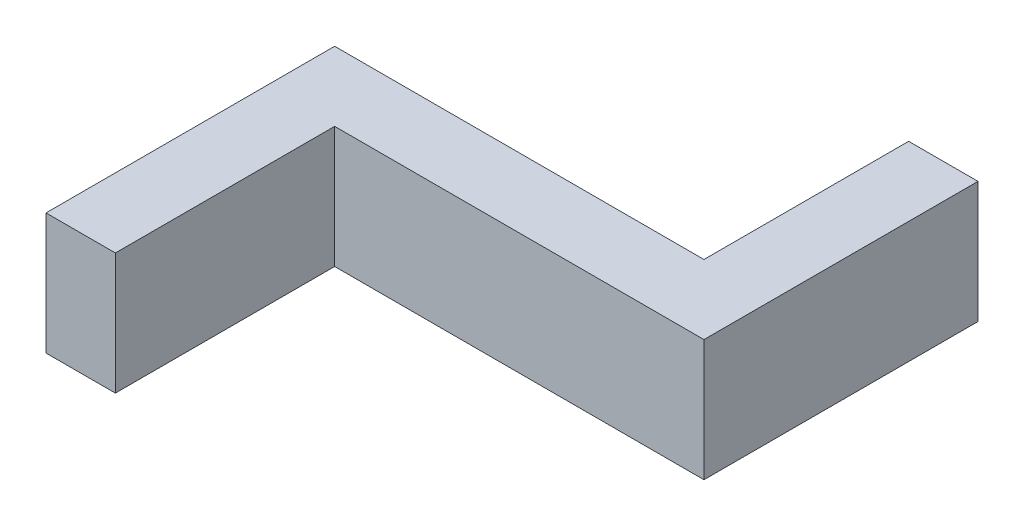
ISO-10303-21;
HEADER;
FILE_DESCRIPTION(('STEP AP214'),'2;1');
FILE_NAME('part.step','',(''),(''),'','','');
FILE_SCHEMA(('AUTOMOTIVE_DESIGN { 1 0 10303 214 1 1 1 1 }'));
ENDSEC;
DATA;
#1=APPLICATION_CONTEXT('core data for automotive mechanical design processes');
#2=APPLICATION_PROTOCOL_DEFINITION('international standard','automotive_design',2000,#1);
#3=PRODUCT_CONTEXT('',#1,'mechanical');
#4=PRODUCT('Part','Part','',(#3));
#5=PRODUCT_RELATED_PRODUCT_CATEGORY('part','',(#4));
#6=PRODUCT_DEFINITION_FORMATION('','',#4);
#7=PRODUCT_DEFINITION_CONTEXT('part definition',#1,'design');
#8=PRODUCT_DEFINITION('design','',#6,#7);
#9=PRODUCT_DEFINITION_SHAPE('','',#8);
#10=(LENGTH_UNIT() NAMED_UNIT(*) SI_UNIT(.MILLI.,.METRE.));
#11=(NAMED_UNIT(*) PLANE_ANGLE_UNIT() SI_UNIT($,.RADIAN.));
#12=(NAMED_UNIT(*) SI_UNIT($,.STERADIAN.) SOLID_ANGLE_UNIT());
#13=UNCERTAINTY_MEASURE_WITH_UNIT(LENGTH_MEASURE(1.E-05),#10,'distance_accuracy_value','');
#14=(GEOMETRIC_REPRESENTATION_CONTEXT(3) GLOBAL_UNCERTAINTY_ASSIGNED_CONTEXT((#13)) GLOBAL_UNIT_ASSIGNED_CONTEXT((#10,
#11,#12)) REPRESENTATION_CONTEXT('',''));
#15=CARTESIAN_POINT('',(0.,0.,0.));
#16=DIRECTION('',(0.,0.,1.));
#17=DIRECTION('',(1.,0.,0.));
#18=AXIS2_PLACEMENT_3D('',#15,#16,#17);
#19=CARTESIAN_POINT('',(0.,8.5,0.));
#20=DIRECTION('',(0.,1.,0.));
#21=DIRECTION('',(0.,0.,1.));
#22=AXIS2_PLACEMENT_3D('',#19,#20,#21);
#23=PLANE('',#22);
#24=DIRECTION('',(-1.,0.,0.));
#25=VECTOR('',#24,1.);
#26=CARTESIAN_POINT('',(72.7421192218373,8.5,-71.));
#27=LINE('',#26,#25);
#28=CARTESIAN_POINT('',(72.7421192218373,8.5,-71.));
#29=VERTEX_POINT('',#28);
#30=CARTESIAN_POINT('',(68.7421192218372,8.5,-71.0000000000003));
#31=VERTEX_POINT('',#30);
#32=EDGE_CURVE('E48',#29,#31,#27,.T.);
#33=ORIENTED_EDGE('',*,*,#32,.T.);
#34=DIRECTION('',(0.,0.,1.));
#35=VECTOR('',#34,1.);
#36=CARTESIAN_POINT('',(68.7421192218372,8.5,-71.0000000000003));
#37=LINE('',#36,#35);
#38=CARTESIAN_POINT('',(68.7421192218372,8.5,-59.1986016699618));
#39=VERTEX_POINT('',#38);
#40=EDGE_CURVE('E90',#31,#39,#37,.T.);
#41=ORIENTED_EDGE('',*,*,#40,.T.);
#42=DIRECTION('',(-1.,0.,0.));
#43=VECTOR('',#42,1.);
#44=CARTESIAN_POINT('',(68.7421192218372,8.5,-59.1986016699618));
#45=LINE('',#44,#43);
#46=CARTESIAN_POINT('',(47.4470564985337,8.5,-59.1986016699618));
#47=VERTEX_POINT('',#46);
#48=EDGE_CURVE('E93',#39,#47,#45,.T.);
#49=ORIENTED_EDGE('',*,*,#48,.T.);
#50=DIRECTION('',(0.,0.,1.));
#51=VECTOR('',#50,1.);
#52=CARTESIAN_POINT('',(47.4470564985337,8.5,-59.1986016699618));
#53=LINE('',#52,#51);
#54=CARTESIAN_POINT('',(47.4470564985337,8.5,-42.5546581780002));
#55=VERTEX_POINT('',#54);
#56=EDGE_CURVE('E109',#47,#55,#53,.T.);
#57=ORIENTED_EDGE('',*,*,#56,.T.);
#58=DIRECTION('',(1.,0.,0.));
#59=VECTOR('',#58,1.);
#60=CARTESIAN_POINT('',(47.4470564985337,8.5,-42.5546581780002));
#61=LINE('',#60,#59);
#62=CARTESIAN_POINT('',(51.4470564985337,8.5,-42.5546581780002));
#63=VERTEX_POINT('',#62);
#64=EDGE_CURVE('E111',#55,#63,#61,.T.);
#65=ORIENTED_EDGE('',*,*,#64,.T.);
#66=DIRECTION('',(0.,0.,-1.));
#67=VECTOR('',#66,1.);
#68=CARTESIAN_POINT('',(51.4470564985337,8.5,-42.5546581780002));
#69=LINE('',#68,#67);
#70=CARTESIAN_POINT('',(51.4470564985337,8.5,-55.1986016699618));
#71=VERTEX_POINT('',#70);
#72=EDGE_CURVE('E115',#63,#71,#69,.T.);
#73=ORIENTED_EDGE('',*,*,#72,.T.);
#74=DIRECTION('',(1.,0.,0.));
#75=VECTOR('',#74,1.);
#76=CARTESIAN_POINT('',(51.4470564985337,8.5,-55.1986016699618));
#77=LINE('',#76,#75);
#78=CARTESIAN_POINT('',(72.7421192218373,8.5,-55.1986016699618));
#79=VERTEX_POINT('',#78);
#80=EDGE_CURVE('E117',#71,#79,#77,.T.);
#81=ORIENTED_EDGE('',*,*,#80,.T.);
#82=DIRECTION('',(0.,0.,-1.));
#83=VECTOR('',#82,1.);
#84=CARTESIAN_POINT('',(72.7421192218373,8.5,-55.1986016699618));
#85=LINE('',#84,#83);
#86=EDGE_CURVE('E119',#79,#29,#85,.T.);
#87=ORIENTED_EDGE('',*,*,#86,.T.);
#88=EDGE_LOOP('',(#33,#41,#49,#57,#65,#73,#81,#87));
#89=FACE_BOUND('',#88,.T.);
#90=ADVANCED_FACE('F45',(#89),#23,.T.);
#91=CARTESIAN_POINT('',(68.7421192218372,8.5,-59.1986016699618));
#92=DIRECTION('',(0.,0.,1.));
#93=DIRECTION('',(1.,0.,0.));
#94=AXIS2_PLACEMENT_3D('',#91,#92,#93);
#95=PLANE('',#94);
#96=DIRECTION('',(-1.,0.,0.));
#97=VECTOR('',#96,1.);
#98=CARTESIAN_POINT('',(68.7421192218372,1.5,-59.1986016699618));
#99=LINE('',#98,#97);
#100=CARTESIAN_POINT('',(68.7421192218372,1.5,-59.1986016699618));
#101=VERTEX_POINT('',#100);
#102=CARTESIAN_POINT('',(47.4470564985337,1.5,-59.1986016699618));
#103=VERTEX_POINT('',#102);
#104=EDGE_CURVE('E62',#101,#103,#99,.T.);
#105=ORIENTED_EDGE('',*,*,#104,.T.);
#106=DIRECTION('',(0.,-1.,0.));
#107=VECTOR('',#106,1.);
#108=CARTESIAN_POINT('',(47.4470564985337,8.5,-59.1986016699618));
#109=LINE('',#108,#107);
#110=EDGE_CURVE('E103',#47,#103,#109,.T.);
#111=ORIENTED_EDGE('',*,*,#110,.F.);
#112=ORIENTED_EDGE('',*,*,#48,.F.);
#113=DIRECTION('',(0.,-1.,0.));
#114=VECTOR('',#113,1.);
#115=CARTESIAN_POINT('',(68.7421192218372,8.5,-59.1986016699618));
#116=LINE('',#115,#114);
#117=EDGE_CURVE('E100',#39,#101,#116,.T.);
#118=ORIENTED_EDGE('',*,*,#117,.T.);
#119=EDGE_LOOP('',(#105,#111,#112,#118));
#120=FACE_BOUND('',#119,.T.);
#121=ADVANCED_FACE('F106',(#120),#95,.F.);
#122=CARTESIAN_POINT('',(47.4470564985337,8.5,-59.1986016699618));
#123=DIRECTION('',(1.,0.,0.));
#124=DIRECTION('',(0.,0.,-1.));
#125=AXIS2_PLACEMENT_3D('',#122,#123,#124);
#126=PLANE('',#125);
#127=DIRECTION('',(0.,0.,1.));
#128=VECTOR('',#127,1.);
#129=CARTESIAN_POINT('',(47.4470564985337,1.5,-59.1986016699618));
#130=LINE('',#129,#128);
#131=CARTESIAN_POINT('',(47.4470564985337,1.5,-42.5546581780002));
#132=VERTEX_POINT('',#131);
#133=EDGE_CURVE('E124',#103,#132,#130,.T.);
#134=ORIENTED_EDGE('',*,*,#133,.T.);
#135=DIRECTION('',(0.,-1.,0.));
#136=VECTOR('',#135,1.);
#137=CARTESIAN_POINT('',(47.4470564985337,8.5,-42.5546581780002));
#138=LINE('',#137,#136);
#139=EDGE_CURVE('E150',#55,#132,#138,.T.);
#140=ORIENTED_EDGE('',*,*,#139,.F.);
#141=ORIENTED_EDGE('',*,*,#56,.F.);
#142=ORIENTED_EDGE('',*,*,#110,.T.);
#143=EDGE_LOOP('',(#134,#140,#141,#142));
#144=FACE_BOUND('',#143,.T.);
#145=ADVANCED_FACE('F191',(#144),#126,.F.);
#146=CARTESIAN_POINT('',(47.4470564985337,8.5,-42.5546581780002));
#147=DIRECTION('',(0.,0.,-1.));
#148=DIRECTION('',(-1.,0.,0.));
#149=AXIS2_PLACEMENT_3D('',#146,#147,#148);
#150=PLANE('',#149);
#151=DIRECTION('',(1.,0.,0.));
#152=VECTOR('',#151,1.);
#153=CARTESIAN_POINT('',(47.4470564985337,1.5,-42.5546581780002));
#154=LINE('',#153,#152);
#155=CARTESIAN_POINT('',(51.4470564985337,1.5,-42.5546581780002));
#156=VERTEX_POINT('',#155);
#157=EDGE_CURVE('E127',#132,#156,#154,.T.);
#158=ORIENTED_EDGE('',*,*,#157,.T.);
#159=DIRECTION('',(0.,-1.,0.));
#160=VECTOR('',#159,1.);
#161=CARTESIAN_POINT('',(51.4470564985337,8.5,-42.5546581780002));
#162=LINE('',#161,#160);
#163=EDGE_CURVE('E147',#63,#156,#162,.T.);
#164=ORIENTED_EDGE('',*,*,#163,.F.);
#165=ORIENTED_EDGE('',*,*,#64,.F.);
#166=ORIENTED_EDGE('',*,*,#139,.T.);
#167=EDGE_LOOP('',(#158,#164,#165,#166));
#168=FACE_BOUND('',#167,.T.);
#169=ADVANCED_FACE('F188',(#168),#150,.F.);
#170=CARTESIAN_POINT('',(51.4470564985337,8.5,-42.5546581780002));
#171=DIRECTION('',(-1.,0.,0.));
#172=DIRECTION('',(0.,0.,1.));
#173=AXIS2_PLACEMENT_3D('',#170,#171,#172);
#174=PLANE('',#173);
#175=DIRECTION('',(0.,0.,-1.));
#176=VECTOR('',#175,1.);
#177=CARTESIAN_POINT('',(51.4470564985337,1.5,-42.5546581780002));
#178=LINE('',#177,#176);
#179=CARTESIAN_POINT('',(51.4470564985337,1.5,-55.1986016699618));
#180=VERTEX_POINT('',#179);
#181=EDGE_CURVE('E130',#156,#180,#178,.T.);
#182=ORIENTED_EDGE('',*,*,#181,.T.);
#183=DIRECTION('',(0.,-1.,0.));
#184=VECTOR('',#183,1.);
#185=CARTESIAN_POINT('',(51.4470564985337,8.5,-55.1986016699618));
#186=LINE('',#185,#184);
#187=EDGE_CURVE('E144',#71,#180,#186,.T.);
#188=ORIENTED_EDGE('',*,*,#187,.F.);
#189=ORIENTED_EDGE('',*,*,#72,.F.);
#190=ORIENTED_EDGE('',*,*,#163,.T.);
#191=EDGE_LOOP('',(#182,#188,#189,#190));
#192=FACE_BOUND('',#191,.T.);
#193=ADVANCED_FACE('F181',(#192),#174,.F.);
#194=CARTESIAN_POINT('',(51.4470564985337,8.5,-55.1986016699618));
#195=DIRECTION('',(0.,0.,-1.));
#196=DIRECTION('',(-1.,0.,0.));
#197=AXIS2_PLACEMENT_3D('',#194,#195,#196);
#198=PLANE('',#197);
#199=DIRECTION('',(1.,0.,0.));
#200=VECTOR('',#199,1.);
#201=CARTESIAN_POINT('',(51.4470564985337,1.5,-55.1986016699618));
#202=LINE('',#201,#200);
#203=CARTESIAN_POINT('',(72.7421192218373,1.5,-55.1986016699618));
#204=VERTEX_POINT('',#203);
#205=EDGE_CURVE('E133',#180,#204,#202,.T.);
#206=ORIENTED_EDGE('',*,*,#205,.T.);
#207=DIRECTION('',(0.,-1.,0.));
#208=VECTOR('',#207,1.);
#209=CARTESIAN_POINT('',(72.7421192218373,8.5,-55.1986016699618));
#210=LINE('',#209,#208);
#211=EDGE_CURVE('E141',#79,#204,#210,.T.);
#212=ORIENTED_EDGE('',*,*,#211,.F.);
#213=ORIENTED_EDGE('',*,*,#80,.F.);
#214=ORIENTED_EDGE('',*,*,#187,.T.);
#215=EDGE_LOOP('',(#206,#212,#213,#214));
#216=FACE_BOUND('',#215,.T.);
#217=ADVANCED_FACE('F174',(#216),#198,.F.);
#218=CARTESIAN_POINT('',(72.7421192218373,8.5,-55.1986016699618));
#219=DIRECTION('',(-1.,0.,0.));
#220=DIRECTION('',(0.,0.,1.));
#221=AXIS2_PLACEMENT_3D('',#218,#219,#220);
#222=PLANE('',#221);
#223=DIRECTION('',(0.,0.,-1.));
#224=VECTOR('',#223,1.);
#225=CARTESIAN_POINT('',(72.7421192218373,1.5,-55.1986016699618));
#226=LINE('',#225,#224);
#227=CARTESIAN_POINT('',(72.7421192218373,1.5,-71.));
#228=VERTEX_POINT('',#227);
#229=EDGE_CURVE('E136',#204,#228,#226,.T.);
#230=ORIENTED_EDGE('',*,*,#229,.T.);
#231=DIRECTION('',(0.,-1.,0.));
#232=VECTOR('',#231,1.);
#233=CARTESIAN_POINT('',(72.7421192218373,8.5,-71.));
#234=LINE('',#233,#232);
#235=EDGE_CURVE('E120',#29,#228,#234,.T.);
#236=ORIENTED_EDGE('',*,*,#235,.F.);
#237=ORIENTED_EDGE('',*,*,#86,.F.);
#238=ORIENTED_EDGE('',*,*,#211,.T.);
#239=EDGE_LOOP('',(#230,#236,#237,#238));
#240=FACE_BOUND('',#239,.T.);
#241=ADVANCED_FACE('F167',(#240),#222,.F.);
#242=CARTESIAN_POINT('',(72.7421192218373,8.5,-71.));
#243=DIRECTION('',(0.,0.,1.));
#244=DIRECTION('',(1.,0.,0.));
#245=AXIS2_PLACEMENT_3D('',#242,#243,#244);
#246=PLANE('',#245);
#247=DIRECTION('',(-1.,0.,0.));
#248=VECTOR('',#247,1.);
#249=CARTESIAN_POINT('',(72.7421192218373,1.5,-71.));
#250=LINE('',#249,#248);
#251=CARTESIAN_POINT('',(68.7421192218372,1.5,-71.0000000000003));
#252=VERTEX_POINT('',#251);
#253=EDGE_CURVE('E11',#228,#252,#250,.T.);
#254=ORIENTED_EDGE('',*,*,#253,.T.);
#255=DIRECTION('',(0.,-1.,0.));
#256=VECTOR('',#255,1.);
#257=CARTESIAN_POINT('',(68.7421192218372,8.5,-71.0000000000003));
#258=LINE('',#257,#256);
#259=EDGE_CURVE('E104',#31,#252,#258,.T.);
#260=ORIENTED_EDGE('',*,*,#259,.F.);
#261=ORIENTED_EDGE('',*,*,#32,.F.);
#262=ORIENTED_EDGE('',*,*,#235,.T.);
#263=EDGE_LOOP('',(#254,#260,#261,#262));
#264=FACE_BOUND('',#263,.T.);
#265=ADVANCED_FACE('F159',(#264),#246,.F.);
#266=CARTESIAN_POINT('',(68.7421192218372,8.5,-71.0000000000003));
#267=DIRECTION('',(1.,0.,0.));
#268=DIRECTION('',(0.,0.,-1.));
#269=AXIS2_PLACEMENT_3D('',#266,#267,#268);
#270=PLANE('',#269);
#271=DIRECTION('',(0.,0.,1.));
#272=VECTOR('',#271,1.);
#273=CARTESIAN_POINT('',(68.7421192218372,1.5,-71.0000000000003));
#274=LINE('',#273,#272);
#275=EDGE_CURVE('E54',#252,#101,#274,.T.);
#276=ORIENTED_EDGE('',*,*,#275,.T.);
#277=ORIENTED_EDGE('',*,*,#117,.F.);
#278=ORIENTED_EDGE('',*,*,#40,.F.);
#279=ORIENTED_EDGE('',*,*,#259,.T.);
#280=EDGE_LOOP('',(#276,#277,#278,#279));
#281=FACE_BOUND('',#280,.T.);
#282=ADVANCED_FACE('F101',(#281),#270,.F.);
#283=CARTESIAN_POINT('',(73.3743669279539,1.5,-99.6600063705348));
#284=DIRECTION('',(0.,1.,0.));
#285=DIRECTION('',(0.,0.,1.));
#286=AXIS2_PLACEMENT_3D('',#283,#284,#285);
#287=PLANE('',#286);
#288=ORIENTED_EDGE('',*,*,#275,.F.);
#289=ORIENTED_EDGE('',*,*,#253,.F.);
#290=ORIENTED_EDGE('',*,*,#229,.F.);
#291=ORIENTED_EDGE('',*,*,#205,.F.);
#292=ORIENTED_EDGE('',*,*,#181,.F.);
#293=ORIENTED_EDGE('',*,*,#157,.F.);
#294=ORIENTED_EDGE('',*,*,#133,.F.);
#295=ORIENTED_EDGE('',*,*,#104,.F.);
#296=EDGE_LOOP('',(#288,#289,#290,#291,#292,#293,#294,#295));
#297=FACE_BOUND('',#296,.T.);
#298=ADVANCED_FACE('F162',(#297),#287,.F.);
#299=CLOSED_SHELL('',(#90,#121,#145,#169,#193,#217,#241,#265,#282,#298));
#300=MANIFOLD_SOLID_BREP('B2',#299);
#301=ADVANCED_BREP_SHAPE_REPRESENTATION('',(#18,#300),#14);
#302=SHAPE_DEFINITION_REPRESENTATION(#9,#301);
ENDSEC;
END-ISO-10303-21;
